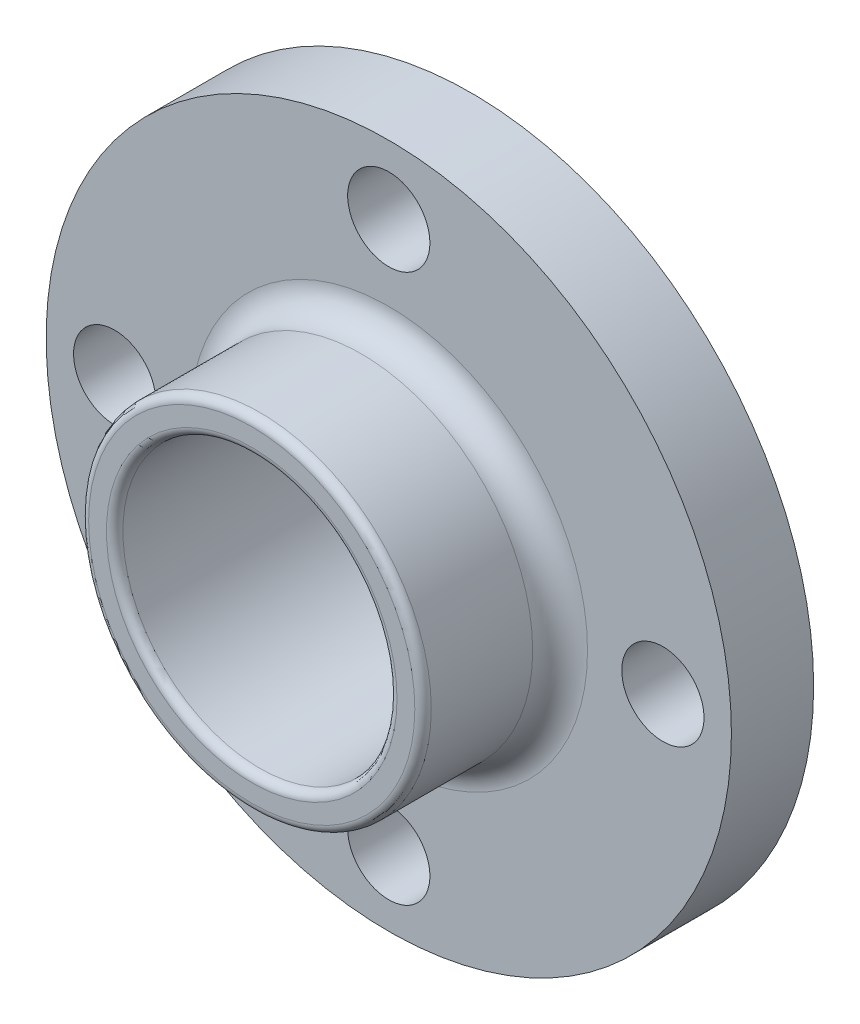
ISO-10303-21;
HEADER;
FILE_DESCRIPTION(('STEP AP214'),'2;1');
FILE_NAME('part.step','',(''),(''),'','','');
FILE_SCHEMA(('AUTOMOTIVE_DESIGN { 1 0 10303 214 1 1 1 1 }'));
ENDSEC;
DATA;
#1=APPLICATION_CONTEXT('core data for automotive mechanical design processes');
#2=APPLICATION_PROTOCOL_DEFINITION('international standard','automotive_design',2000,#1);
#3=PRODUCT_CONTEXT('',#1,'mechanical');
#4=PRODUCT('Part','Part','',(#3));
#5=PRODUCT_RELATED_PRODUCT_CATEGORY('part','',(#4));
#6=PRODUCT_DEFINITION_FORMATION('','',#4);
#7=PRODUCT_DEFINITION_CONTEXT('part definition',#1,'design');
#8=PRODUCT_DEFINITION('design','',#6,#7);
#9=PRODUCT_DEFINITION_SHAPE('','',#8);
#10=(LENGTH_UNIT() NAMED_UNIT(*) SI_UNIT(.MILLI.,.METRE.));
#11=(NAMED_UNIT(*) PLANE_ANGLE_UNIT() SI_UNIT($,.RADIAN.));
#12=(NAMED_UNIT(*) SI_UNIT($,.STERADIAN.) SOLID_ANGLE_UNIT());
#13=UNCERTAINTY_MEASURE_WITH_UNIT(LENGTH_MEASURE(1.E-05),#10,'distance_accuracy_value','');
#14=(GEOMETRIC_REPRESENTATION_CONTEXT(3) GLOBAL_UNCERTAINTY_ASSIGNED_CONTEXT((#13)) GLOBAL_UNIT_ASSIGNED_CONTEXT((#10,
#11,#12)) REPRESENTATION_CONTEXT('',''));
#15=CARTESIAN_POINT('',(0.,0.,0.));
#16=DIRECTION('',(0.,0.,1.));
#17=DIRECTION('',(1.,0.,0.));
#18=AXIS2_PLACEMENT_3D('',#15,#16,#17);
#19=CARTESIAN_POINT('',(0.,0.,0.3));
#20=DIRECTION('',(0.,0.,1.));
#21=DIRECTION('',(1.,0.,0.));
#22=AXIS2_PLACEMENT_3D('',#19,#20,#21);
#23=PLANE('',#22);
#24=CARTESIAN_POINT('',(0.,0.,0.3));
#25=DIRECTION('',(0.,0.,1.));
#26=DIRECTION('',(1.,0.,0.));
#27=AXIS2_PLACEMENT_3D('',#24,#25,#26);
#28=CIRCLE('',#27,0.725);
#29=CARTESIAN_POINT('',(0.725,0.,0.3));
#30=VERTEX_POINT('',#29);
#31=EDGE_CURVE('E53',#30,#30,#28,.F.);
#32=ORIENTED_EDGE('',*,*,#31,.T.);
#33=EDGE_LOOP('',(#32));
#34=FACE_BOUND('',#33,.T.);
#35=CARTESIAN_POINT('',(0.,0.,0.3));
#36=DIRECTION('',(0.,0.,1.));
#37=DIRECTION('',(1.,0.,0.));
#38=AXIS2_PLACEMENT_3D('',#35,#36,#37);
#39=CIRCLE('',#38,1.25);
#40=CARTESIAN_POINT('',(1.25,0.,0.3));
#41=VERTEX_POINT('',#40);
#42=EDGE_CURVE('E59',#41,#41,#39,.T.);
#43=ORIENTED_EDGE('',*,*,#42,.T.);
#44=EDGE_LOOP('',(#43));
#45=FACE_BOUND('',#44,.T.);
#46=CARTESIAN_POINT('',(0.,1.,0.3));
#47=DIRECTION('',(0.,0.,1.));
#48=DIRECTION('',(1.,0.,0.));
#49=AXIS2_PLACEMENT_3D('',#46,#47,#48);
#50=CIRCLE('',#49,0.15);
#51=CARTESIAN_POINT('',(0.15,1.,0.3));
#52=VERTEX_POINT('',#51);
#53=EDGE_CURVE('E66',#52,#52,#50,.T.);
#54=ORIENTED_EDGE('',*,*,#53,.F.);
#55=EDGE_LOOP('',(#54));
#56=FACE_BOUND('',#55,.T.);
#57=CARTESIAN_POINT('',(-1.,0.,0.3));
#58=DIRECTION('',(0.,0.,1.));
#59=DIRECTION('',(0.,1.,0.));
#60=AXIS2_PLACEMENT_3D('',#57,#58,#59);
#61=CIRCLE('',#60,0.15);
#62=CARTESIAN_POINT('',(-1.,0.149999999999996,0.3));
#63=VERTEX_POINT('',#62);
#64=EDGE_CURVE('E72',#63,#63,#61,.T.);
#65=ORIENTED_EDGE('',*,*,#64,.F.);
#66=EDGE_LOOP('',(#65));
#67=FACE_BOUND('',#66,.T.);
#68=CARTESIAN_POINT('',(0.,-1.,0.3));
#69=DIRECTION('',(0.,0.,1.));
#70=DIRECTION('',(-1.,0.,0.));
#71=AXIS2_PLACEMENT_3D('',#68,#69,#70);
#72=CIRCLE('',#71,0.15);
#73=CARTESIAN_POINT('',(-0.15,-1.,0.3));
#74=VERTEX_POINT('',#73);
#75=EDGE_CURVE('E78',#74,#74,#72,.T.);
#76=ORIENTED_EDGE('',*,*,#75,.F.);
#77=EDGE_LOOP('',(#76));
#78=FACE_BOUND('',#77,.T.);
#79=CARTESIAN_POINT('',(1.,0.,0.3));
#80=DIRECTION('',(0.,0.,1.));
#81=DIRECTION('',(0.,-1.,0.));
#82=AXIS2_PLACEMENT_3D('',#79,#80,#81);
#83=CIRCLE('',#82,0.15);
#84=CARTESIAN_POINT('',(1.,-0.14999999999999,0.3));
#85=VERTEX_POINT('',#84);
#86=EDGE_CURVE('E84',#85,#85,#83,.T.);
#87=ORIENTED_EDGE('',*,*,#86,.F.);
#88=EDGE_LOOP('',(#87));
#89=FACE_BOUND('',#88,.T.);
#90=ADVANCED_FACE('F33',(#34,#45,#56,#67,#78,#89),#23,.T.);
#91=CARTESIAN_POINT('',(0.,0.,0.3));
#92=DIRECTION('',(0.,0.,-1.));
#93=DIRECTION('',(-1.,0.,0.));
#94=AXIS2_PLACEMENT_3D('',#91,#92,#93);
#95=CYLINDRICAL_SURFACE('',#94,1.25);
#96=ORIENTED_EDGE('',*,*,#42,.F.);
#97=EDGE_LOOP('',(#96));
#98=FACE_BOUND('',#97,.T.);
#99=CARTESIAN_POINT('',(0.,0.,0.));
#100=DIRECTION('',(0.,0.,1.));
#101=DIRECTION('',(1.,0.,0.));
#102=AXIS2_PLACEMENT_3D('',#99,#100,#101);
#103=CIRCLE('',#102,1.25);
#104=CARTESIAN_POINT('',(1.25,0.,0.));
#105=VERTEX_POINT('',#104);
#106=EDGE_CURVE('E60',#105,#105,#103,.T.);
#107=ORIENTED_EDGE('',*,*,#106,.T.);
#108=EDGE_LOOP('',(#107));
#109=FACE_BOUND('',#108,.T.);
#110=ADVANCED_FACE('F112',(#98,#109),#95,.T.);
#111=CARTESIAN_POINT('',(0.,0.,0.));
#112=DIRECTION('',(0.,0.,1.));
#113=DIRECTION('',(1.,0.,0.));
#114=AXIS2_PLACEMENT_3D('',#111,#112,#113);
#115=PLANE('',#114);
#116=CARTESIAN_POINT('',(0.,0.,0.));
#117=DIRECTION('',(0.,0.,1.));
#118=DIRECTION('',(1.,0.,0.));
#119=AXIS2_PLACEMENT_3D('',#116,#117,#118);
#120=CIRCLE('',#119,0.5);
#121=CARTESIAN_POINT('',(0.5,0.,0.));
#122=VERTEX_POINT('',#121);
#123=EDGE_CURVE('E87',#122,#122,#120,.T.);
#124=ORIENTED_EDGE('',*,*,#123,.T.);
#125=EDGE_LOOP('',(#124));
#126=FACE_BOUND('',#125,.T.);
#127=CARTESIAN_POINT('',(1.,0.,0.));
#128=DIRECTION('',(0.,0.,1.));
#129=DIRECTION('',(0.,-1.,0.));
#130=AXIS2_PLACEMENT_3D('',#127,#128,#129);
#131=CIRCLE('',#130,0.15);
#132=CARTESIAN_POINT('',(1.,-0.14999999999999,0.));
#133=VERTEX_POINT('',#132);
#134=EDGE_CURVE('E81',#133,#133,#131,.T.);
#135=ORIENTED_EDGE('',*,*,#134,.T.);
#136=EDGE_LOOP('',(#135));
#137=FACE_BOUND('',#136,.T.);
#138=CARTESIAN_POINT('',(0.,-1.,0.));
#139=DIRECTION('',(0.,0.,1.));
#140=DIRECTION('',(-1.,0.,0.));
#141=AXIS2_PLACEMENT_3D('',#138,#139,#140);
#142=CIRCLE('',#141,0.15);
#143=CARTESIAN_POINT('',(-0.15,-1.,0.));
#144=VERTEX_POINT('',#143);
#145=EDGE_CURVE('E75',#144,#144,#142,.T.);
#146=ORIENTED_EDGE('',*,*,#145,.T.);
#147=EDGE_LOOP('',(#146));
#148=FACE_BOUND('',#147,.T.);
#149=CARTESIAN_POINT('',(-1.,0.,0.));
#150=DIRECTION('',(0.,0.,1.));
#151=DIRECTION('',(0.,1.,0.));
#152=AXIS2_PLACEMENT_3D('',#149,#150,#151);
#153=CIRCLE('',#152,0.15);
#154=CARTESIAN_POINT('',(-1.,0.149999999999996,0.));
#155=VERTEX_POINT('',#154);
#156=EDGE_CURVE('E69',#155,#155,#153,.T.);
#157=ORIENTED_EDGE('',*,*,#156,.T.);
#158=EDGE_LOOP('',(#157));
#159=FACE_BOUND('',#158,.T.);
#160=CARTESIAN_POINT('',(0.,1.,0.));
#161=DIRECTION('',(0.,0.,1.));
#162=DIRECTION('',(1.,0.,0.));
#163=AXIS2_PLACEMENT_3D('',#160,#161,#162);
#164=CIRCLE('',#163,0.15);
#165=CARTESIAN_POINT('',(0.15,1.,0.));
#166=VERTEX_POINT('',#165);
#167=EDGE_CURVE('E63',#166,#166,#164,.T.);
#168=ORIENTED_EDGE('',*,*,#167,.T.);
#169=EDGE_LOOP('',(#168));
#170=FACE_BOUND('',#169,.T.);
#171=ORIENTED_EDGE('',*,*,#106,.F.);
#172=EDGE_LOOP('',(#171));
#173=FACE_BOUND('',#172,.T.);
#174=ADVANCED_FACE('F93',(#126,#137,#148,#159,#170,#173),#115,.F.);
#175=CARTESIAN_POINT('',(0.,1.,0.));
#176=DIRECTION('',(0.,0.,1.));
#177=DIRECTION('',(1.,0.,0.));
#178=AXIS2_PLACEMENT_3D('',#175,#176,#177);
#179=CYLINDRICAL_SURFACE('',#178,0.15);
#180=ORIENTED_EDGE('',*,*,#167,.F.);
#181=EDGE_LOOP('',(#180));
#182=FACE_BOUND('',#181,.T.);
#183=ORIENTED_EDGE('',*,*,#53,.T.);
#184=EDGE_LOOP('',(#183));
#185=FACE_BOUND('',#184,.T.);
#186=ADVANCED_FACE('F123',(#182,#185),#179,.F.);
#187=CARTESIAN_POINT('',(-1.,0.,0.));
#188=DIRECTION('',(0.,0.,1.));
#189=DIRECTION('',(1.,0.,0.));
#190=AXIS2_PLACEMENT_3D('',#187,#188,#189);
#191=CYLINDRICAL_SURFACE('',#190,0.15);
#192=ORIENTED_EDGE('',*,*,#156,.F.);
#193=EDGE_LOOP('',(#192));
#194=FACE_BOUND('',#193,.T.);
#195=ORIENTED_EDGE('',*,*,#64,.T.);
#196=EDGE_LOOP('',(#195));
#197=FACE_BOUND('',#196,.T.);
#198=ADVANCED_FACE('F200',(#194,#197),#191,.F.);
#199=CARTESIAN_POINT('',(0.,-1.,0.));
#200=DIRECTION('',(0.,0.,1.));
#201=DIRECTION('',(1.,0.,0.));
#202=AXIS2_PLACEMENT_3D('',#199,#200,#201);
#203=CYLINDRICAL_SURFACE('',#202,0.15);
#204=ORIENTED_EDGE('',*,*,#145,.F.);
#205=EDGE_LOOP('',(#204));
#206=FACE_BOUND('',#205,.T.);
#207=ORIENTED_EDGE('',*,*,#75,.T.);
#208=EDGE_LOOP('',(#207));
#209=FACE_BOUND('',#208,.T.);
#210=ADVANCED_FACE('F190',(#206,#209),#203,.F.);
#211=CARTESIAN_POINT('',(1.,0.,0.));
#212=DIRECTION('',(0.,0.,1.));
#213=DIRECTION('',(1.,0.,0.));
#214=AXIS2_PLACEMENT_3D('',#211,#212,#213);
#215=CYLINDRICAL_SURFACE('',#214,0.15);
#216=ORIENTED_EDGE('',*,*,#134,.F.);
#217=EDGE_LOOP('',(#216));
#218=FACE_BOUND('',#217,.T.);
#219=ORIENTED_EDGE('',*,*,#86,.T.);
#220=EDGE_LOOP('',(#219));
#221=FACE_BOUND('',#220,.T.);
#222=ADVANCED_FACE('F163',(#218,#221),#215,.F.);
#223=CARTESIAN_POINT('',(0.,0.,0.8));
#224=DIRECTION('',(0.,0.,-1.));
#225=DIRECTION('',(-1.,0.,0.));
#226=AXIS2_PLACEMENT_3D('',#223,#224,#225);
#227=CYLINDRICAL_SURFACE('',#226,0.625);
#228=CARTESIAN_POINT('',(0.,0.,0.77));
#229=DIRECTION('',(0.,0.,1.));
#230=DIRECTION('',(1.,0.,0.));
#231=AXIS2_PLACEMENT_3D('',#228,#229,#230);
#232=CIRCLE('',#231,0.625);
#233=CARTESIAN_POINT('',(0.625,0.,0.77));
#234=VERTEX_POINT('',#233);
#235=EDGE_CURVE('E10',#234,#234,#232,.F.);
#236=ORIENTED_EDGE('',*,*,#235,.T.);
#237=EDGE_LOOP('',(#236));
#238=FACE_BOUND('',#237,.T.);
#239=CARTESIAN_POINT('',(0.,0.,0.4));
#240=DIRECTION('',(0.,0.,1.));
#241=DIRECTION('',(1.,0.,0.));
#242=AXIS2_PLACEMENT_3D('',#239,#240,#241);
#243=CIRCLE('',#242,0.625);
#244=CARTESIAN_POINT('',(0.625,0.,0.4));
#245=VERTEX_POINT('',#244);
#246=EDGE_CURVE('E56',#245,#245,#243,.T.);
#247=ORIENTED_EDGE('',*,*,#246,.T.);
#248=EDGE_LOOP('',(#247));
#249=FACE_BOUND('',#248,.T.);
#250=ADVANCED_FACE('F109',(#238,#249),#227,.T.);
#251=CARTESIAN_POINT('',(0.,0.,0.8));
#252=DIRECTION('',(0.,0.,1.));
#253=DIRECTION('',(1.,0.,0.));
#254=AXIS2_PLACEMENT_3D('',#251,#252,#253);
#255=PLANE('',#254);
#256=CARTESIAN_POINT('',(0.,0.,0.8));
#257=DIRECTION('',(0.,0.,1.));
#258=DIRECTION('',(1.,0.,0.));
#259=AXIS2_PLACEMENT_3D('',#256,#257,#258);
#260=CIRCLE('',#259,0.53);
#261=CARTESIAN_POINT('',(0.53,0.,0.8));
#262=VERTEX_POINT('',#261);
#263=EDGE_CURVE('E40',#262,#262,#260,.F.);
#264=ORIENTED_EDGE('',*,*,#263,.T.);
#265=EDGE_LOOP('',(#264));
#266=FACE_BOUND('',#265,.T.);
#267=CARTESIAN_POINT('',(0.,0.,0.8));
#268=DIRECTION('',(0.,0.,1.));
#269=DIRECTION('',(1.,0.,0.));
#270=AXIS2_PLACEMENT_3D('',#267,#268,#269);
#271=CIRCLE('',#270,0.595);
#272=CARTESIAN_POINT('',(0.595,0.,0.8));
#273=VERTEX_POINT('',#272);
#274=EDGE_CURVE('E44',#273,#273,#271,.T.);
#275=ORIENTED_EDGE('',*,*,#274,.T.);
#276=EDGE_LOOP('',(#275));
#277=FACE_BOUND('',#276,.T.);
#278=ADVANCED_FACE('F99',(#266,#277),#255,.T.);
#279=CARTESIAN_POINT('',(0.,0.,-9.7));
#280=DIRECTION('',(0.,0.,1.));
#281=DIRECTION('',(1.,0.,0.));
#282=AXIS2_PLACEMENT_3D('',#279,#280,#281);
#283=CYLINDRICAL_SURFACE('',#282,0.5);
#284=CARTESIAN_POINT('',(0.,0.,0.77));
#285=DIRECTION('',(0.,0.,1.));
#286=DIRECTION('',(1.,0.,0.));
#287=AXIS2_PLACEMENT_3D('',#284,#285,#286);
#288=CIRCLE('',#287,0.5);
#289=CARTESIAN_POINT('',(0.5,0.,0.77));
#290=VERTEX_POINT('',#289);
#291=EDGE_CURVE('E48',#290,#290,#288,.T.);
#292=ORIENTED_EDGE('',*,*,#291,.T.);
#293=EDGE_LOOP('',(#292));
#294=FACE_BOUND('',#293,.T.);
#295=ORIENTED_EDGE('',*,*,#123,.F.);
#296=EDGE_LOOP('',(#295));
#297=FACE_BOUND('',#296,.T.);
#298=ADVANCED_FACE('F96',(#294,#297),#283,.F.);
#299=CARTESIAN_POINT('',(0.,0.,0.4));
#300=DIRECTION('',(0.,0.,1.));
#301=DIRECTION('',(1.,0.,0.));
#302=AXIS2_PLACEMENT_3D('',#299,#300,#301);
#303=TOROIDAL_SURFACE('',#302,0.725,0.1);
#304=ORIENTED_EDGE('',*,*,#31,.F.);
#305=EDGE_LOOP('',(#304));
#306=FACE_BOUND('',#305,.T.);
#307=ORIENTED_EDGE('',*,*,#246,.F.);
#308=EDGE_LOOP('',(#307));
#309=FACE_BOUND('',#308,.T.);
#310=ADVANCED_FACE('F98',(#306,#309),#303,.F.);
#311=CARTESIAN_POINT('',(0.,0.,0.77));
#312=DIRECTION('',(0.,0.,1.));
#313=DIRECTION('',(1.,0.,0.));
#314=AXIS2_PLACEMENT_3D('',#311,#312,#313);
#315=TOROIDAL_SURFACE('',#314,0.53,0.03);
#316=ORIENTED_EDGE('',*,*,#263,.F.);
#317=EDGE_LOOP('',(#316));
#318=FACE_BOUND('',#317,.T.);
#319=ORIENTED_EDGE('',*,*,#291,.F.);
#320=EDGE_LOOP('',(#319));
#321=FACE_BOUND('',#320,.T.);
#322=ADVANCED_FACE('F106',(#318,#321),#315,.T.);
#323=CARTESIAN_POINT('',(0.,0.,0.77));
#324=DIRECTION('',(0.,0.,1.));
#325=DIRECTION('',(1.,0.,0.));
#326=AXIS2_PLACEMENT_3D('',#323,#324,#325);
#327=TOROIDAL_SURFACE('',#326,0.595,0.03);
#328=ORIENTED_EDGE('',*,*,#235,.F.);
#329=EDGE_LOOP('',(#328));
#330=FACE_BOUND('',#329,.T.);
#331=ORIENTED_EDGE('',*,*,#274,.F.);
#332=EDGE_LOOP('',(#331));
#333=FACE_BOUND('',#332,.T.);
#334=ADVANCED_FACE('F35',(#330,#333),#327,.T.);
#335=CLOSED_SHELL('',(#90,#110,#174,#186,#198,#210,#222,#250,#278,#298,#310,#322,#334));
#336=MANIFOLD_SOLID_BREP('B2',#335);
#337=ADVANCED_BREP_SHAPE_REPRESENTATION('',(#18,#336),#14);
#338=SHAPE_DEFINITION_REPRESENTATION(#9,#337);
ENDSEC;
END-ISO-10303-21;
